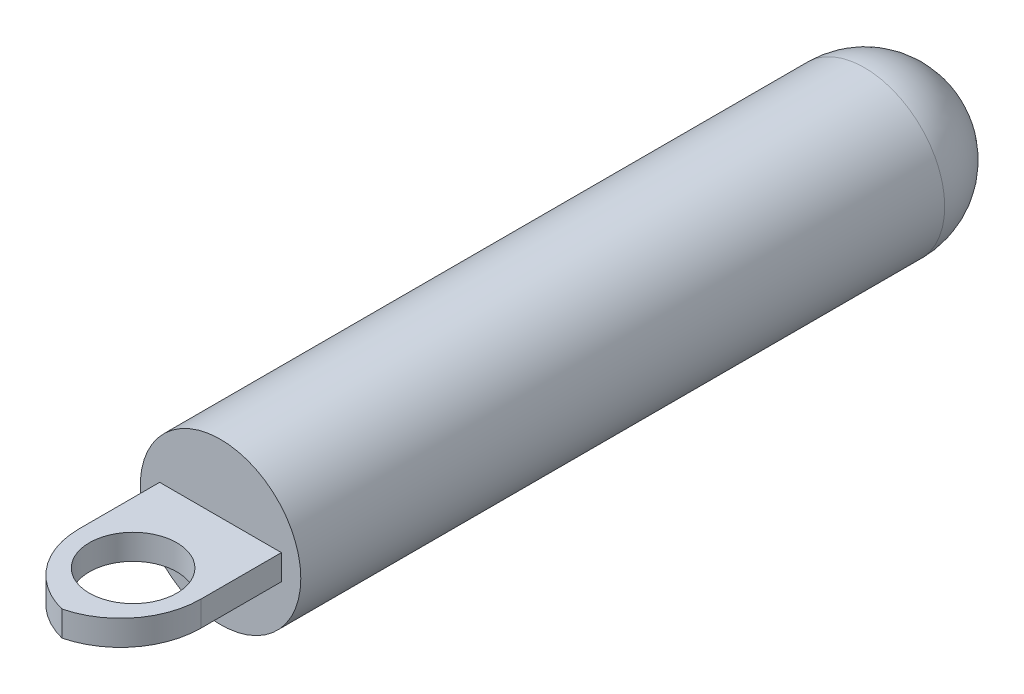
ISO-10303-21;
HEADER;
FILE_DESCRIPTION(('STEP AP214'),'2;1');
FILE_NAME('part.step','',(''),(''),'','','');
FILE_SCHEMA(('AUTOMOTIVE_DESIGN { 1 0 10303 214 1 1 1 1 }'));
ENDSEC;
DATA;
#1=APPLICATION_CONTEXT('core data for automotive mechanical design processes');
#2=APPLICATION_PROTOCOL_DEFINITION('international standard','automotive_design',2000,#1);
#3=PRODUCT_CONTEXT('',#1,'mechanical');
#4=PRODUCT('Part','Part','',(#3));
#5=PRODUCT_RELATED_PRODUCT_CATEGORY('part','',(#4));
#6=PRODUCT_DEFINITION_FORMATION('','',#4);
#7=PRODUCT_DEFINITION_CONTEXT('part definition',#1,'design');
#8=PRODUCT_DEFINITION('design','',#6,#7);
#9=PRODUCT_DEFINITION_SHAPE('','',#8);
#10=(LENGTH_UNIT() NAMED_UNIT(*) SI_UNIT(.MILLI.,.METRE.));
#11=(NAMED_UNIT(*) PLANE_ANGLE_UNIT() SI_UNIT($,.RADIAN.));
#12=(NAMED_UNIT(*) SI_UNIT($,.STERADIAN.) SOLID_ANGLE_UNIT());
#13=UNCERTAINTY_MEASURE_WITH_UNIT(LENGTH_MEASURE(1.E-05),#10,'distance_accuracy_value','');
#14=(GEOMETRIC_REPRESENTATION_CONTEXT(3) GLOBAL_UNCERTAINTY_ASSIGNED_CONTEXT((#13)) GLOBAL_UNIT_ASSIGNED_CONTEXT((#10,
#11,#12)) REPRESENTATION_CONTEXT('',''));
#15=CARTESIAN_POINT('',(0.,0.,0.));
#16=DIRECTION('',(0.,0.,1.));
#17=DIRECTION('',(1.,0.,0.));
#18=AXIS2_PLACEMENT_3D('',#15,#16,#17);
#19=CARTESIAN_POINT('',(0.,0.,16.));
#20=DIRECTION('',(0.,0.,-1.));
#21=DIRECTION('',(-1.,0.,0.));
#22=AXIS2_PLACEMENT_3D('',#19,#20,#21);
#23=CYLINDRICAL_SURFACE('',#22,1.995);
#24=CARTESIAN_POINT('',(0.,0.,16.));
#25=DIRECTION('',(0.,0.,1.));
#26=DIRECTION('',(1.,0.,0.));
#27=AXIS2_PLACEMENT_3D('',#24,#25,#26);
#28=CIRCLE('',#27,1.995);
#29=CARTESIAN_POINT('',(1.995,0.,16.));
#30=VERTEX_POINT('',#29);
#31=EDGE_CURVE('E161',#30,#30,#28,.T.);
#32=ORIENTED_EDGE('',*,*,#31,.F.);
#33=EDGE_LOOP('',(#32));
#34=FACE_BOUND('',#33,.T.);
#35=CARTESIAN_POINT('',(0.,0.,0.));
#36=DIRECTION('',(0.,0.,1.));
#37=DIRECTION('',(1.,0.,0.));
#38=AXIS2_PLACEMENT_3D('',#35,#36,#37);
#39=CIRCLE('',#38,1.995);
#40=CARTESIAN_POINT('',(1.995,0.,0.));
#41=VERTEX_POINT('',#40);
#42=EDGE_CURVE('E159',#41,#41,#39,.T.);
#43=ORIENTED_EDGE('',*,*,#42,.T.);
#44=EDGE_LOOP('',(#43));
#45=FACE_BOUND('',#44,.T.);
#46=ADVANCED_FACE('F83',(#34,#45),#23,.T.);
#47=CARTESIAN_POINT('',(0.,0.,16.));
#48=DIRECTION('',(0.,0.,1.));
#49=DIRECTION('',(1.,0.,0.));
#50=AXIS2_PLACEMENT_3D('',#47,#48,#49);
#51=PLANE('',#50);
#52=DIRECTION('',(0.,1.,0.));
#53=VECTOR('',#52,1.);
#54=CARTESIAN_POINT('',(1.51267010847109,0.313338808183235,16.));
#55=LINE('',#54,#53);
#56=CARTESIAN_POINT('',(1.51267010847109,-0.313338808183235,16.));
#57=VERTEX_POINT('',#56);
#58=CARTESIAN_POINT('',(1.51267010847109,0.313338808183235,16.));
#59=VERTEX_POINT('',#58);
#60=EDGE_CURVE('E149',#57,#59,#55,.T.);
#61=ORIENTED_EDGE('',*,*,#60,.F.);
#62=DIRECTION('',(1.,0.,0.));
#63=VECTOR('',#62,1.);
#64=CARTESIAN_POINT('',(-1.51267010847109,-0.313338808183235,16.));
#65=LINE('',#64,#63);
#66=CARTESIAN_POINT('',(-1.51267010847109,-0.313338808183235,16.));
#67=VERTEX_POINT('',#66);
#68=EDGE_CURVE('E148',#67,#57,#65,.T.);
#69=ORIENTED_EDGE('',*,*,#68,.F.);
#70=DIRECTION('',(0.,-1.,0.));
#71=VECTOR('',#70,1.);
#72=CARTESIAN_POINT('',(-1.51267010847109,0.313338808183235,16.));
#73=LINE('',#72,#71);
#74=CARTESIAN_POINT('',(-1.51267010847109,0.313338808183235,16.));
#75=VERTEX_POINT('',#74);
#76=EDGE_CURVE('E128',#75,#67,#73,.T.);
#77=ORIENTED_EDGE('',*,*,#76,.F.);
#78=DIRECTION('',(-1.,0.,0.));
#79=VECTOR('',#78,1.);
#80=CARTESIAN_POINT('',(-1.51267010847109,0.313338808183235,16.));
#81=LINE('',#80,#79);
#82=EDGE_CURVE('E141',#59,#75,#81,.T.);
#83=ORIENTED_EDGE('',*,*,#82,.F.);
#84=EDGE_LOOP('',(#61,#69,#77,#83));
#85=FACE_BOUND('',#84,.T.);
#86=ORIENTED_EDGE('',*,*,#31,.T.);
#87=EDGE_LOOP('',(#86));
#88=FACE_BOUND('',#87,.T.);
#89=ADVANCED_FACE('F143',(#85,#88),#51,.T.);
#90=CARTESIAN_POINT('',(0.,0.,-0.00499374999999918));
#91=DIRECTION('',(0.,0.,1.));
#92=DIRECTION('',(1.,0.,0.));
#93=AXIS2_PLACEMENT_3D('',#90,#91,#92);
#94=SPHERICAL_SURFACE('',#93,1.99500625);
#95=ORIENTED_EDGE('',*,*,#42,.F.);
#96=EDGE_LOOP('',(#95));
#97=FACE_BOUND('',#96,.T.);
#98=ADVANCED_FACE('F197',(#97),#94,.T.);
#99=CARTESIAN_POINT('',(1.51267010847109,0.313338808183235,20.));
#100=DIRECTION('',(-1.,0.,0.));
#101=DIRECTION('',(0.,0.,1.));
#102=AXIS2_PLACEMENT_3D('',#99,#100,#101);
#103=PLANE('',#102);
#104=DIRECTION('',(0.,0.,-1.));
#105=VECTOR('',#104,1.);
#106=CARTESIAN_POINT('',(1.51267010847109,0.313338808183235,20.));
#107=LINE('',#106,#105);
#108=CARTESIAN_POINT('',(1.51267010847109,0.313338808183235,18.));
#109=VERTEX_POINT('',#108);
#110=EDGE_CURVE('E133',#109,#59,#107,.T.);
#111=ORIENTED_EDGE('',*,*,#110,.F.);
#112=DIRECTION('',(0.,1.,0.));
#113=VECTOR('',#112,1.);
#114=CARTESIAN_POINT('',(1.51267010847109,-0.313338808183235,18.));
#115=LINE('',#114,#113);
#116=CARTESIAN_POINT('',(1.51267010847109,-0.313338808183235,18.));
#117=VERTEX_POINT('',#116);
#118=EDGE_CURVE('E12',#109,#117,#115,.F.);
#119=ORIENTED_EDGE('',*,*,#118,.T.);
#120=DIRECTION('',(0.,0.,-1.));
#121=VECTOR('',#120,1.);
#122=CARTESIAN_POINT('',(1.51267010847109,-0.313338808183235,20.));
#123=LINE('',#122,#121);
#124=EDGE_CURVE('E156',#117,#57,#123,.T.);
#125=ORIENTED_EDGE('',*,*,#124,.T.);
#126=ORIENTED_EDGE('',*,*,#60,.T.);
#127=EDGE_LOOP('',(#111,#119,#125,#126));
#128=FACE_BOUND('',#127,.T.);
#129=ADVANCED_FACE('F186',(#128),#103,.F.);
#130=CARTESIAN_POINT('',(-1.51267010847109,0.313338808183235,20.));
#131=DIRECTION('',(0.,-1.,0.));
#132=DIRECTION('',(0.,0.,-1.));
#133=AXIS2_PLACEMENT_3D('',#130,#131,#132);
#134=PLANE('',#133);
#135=CARTESIAN_POINT('',(0.,0.313338808183235,18.172034212376));
#136=DIRECTION('',(0.,1.,0.));
#137=DIRECTION('',(0.,0.,1.));
#138=AXIS2_PLACEMENT_3D('',#135,#136,#137);
#139=CIRCLE('',#138,1.08651434325027);
#140=CARTESIAN_POINT('',(0.,0.313338808183235,19.2585485556263));
#141=VERTEX_POINT('',#140);
#142=EDGE_CURVE('E180',#141,#141,#139,.T.);
#143=ORIENTED_EDGE('',*,*,#142,.F.);
#144=EDGE_LOOP('',(#143));
#145=FACE_BOUND('',#144,.T.);
#146=DIRECTION('',(0.,0.,-1.));
#147=VECTOR('',#146,1.);
#148=CARTESIAN_POINT('',(-1.51267010847109,0.313338808183235,20.));
#149=LINE('',#148,#147);
#150=CARTESIAN_POINT('',(-1.51267010847109,0.313338808183235,18.));
#151=VERTEX_POINT('',#150);
#152=EDGE_CURVE('E127',#151,#75,#149,.T.);
#153=ORIENTED_EDGE('',*,*,#152,.F.);
#154=CARTESIAN_POINT('',(0.48732989152891,0.313338808183235,18.));
#155=DIRECTION('',(0.,-1.,0.));
#156=DIRECTION('',(0.,0.,-1.));
#157=AXIS2_PLACEMENT_3D('',#154,#155,#156);
#158=CIRCLE('',#157,2.);
#159=CARTESIAN_POINT('',(0.,0.313338808183235,19.9397189427395));
#160=VERTEX_POINT('',#159);
#161=EDGE_CURVE('E89',#151,#160,#158,.F.);
#162=ORIENTED_EDGE('',*,*,#161,.T.);
#163=CARTESIAN_POINT('',(-0.48732989152891,0.313338808183235,18.));
#164=DIRECTION('',(0.,-1.,0.));
#165=DIRECTION('',(0.,0.,-1.));
#166=AXIS2_PLACEMENT_3D('',#163,#164,#165);
#167=CIRCLE('',#166,2.);
#168=EDGE_CURVE('E101',#160,#109,#167,.F.);
#169=ORIENTED_EDGE('',*,*,#168,.T.);
#170=ORIENTED_EDGE('',*,*,#110,.T.);
#171=ORIENTED_EDGE('',*,*,#82,.T.);
#172=EDGE_LOOP('',(#153,#162,#169,#170,#171));
#173=FACE_BOUND('',#172,.T.);
#174=ADVANCED_FACE('F146',(#145,#173),#134,.F.);
#175=CARTESIAN_POINT('',(-1.51267010847109,0.313338808183235,20.));
#176=DIRECTION('',(1.,0.,0.));
#177=DIRECTION('',(0.,0.,-1.));
#178=AXIS2_PLACEMENT_3D('',#175,#176,#177);
#179=PLANE('',#178);
#180=DIRECTION('',(0.,0.,-1.));
#181=VECTOR('',#180,1.);
#182=CARTESIAN_POINT('',(-1.51267010847109,-0.313338808183235,20.));
#183=LINE('',#182,#181);
#184=CARTESIAN_POINT('',(-1.51267010847109,-0.313338808183235,18.));
#185=VERTEX_POINT('',#184);
#186=EDGE_CURVE('E132',#185,#67,#183,.T.);
#187=ORIENTED_EDGE('',*,*,#186,.F.);
#188=DIRECTION('',(0.,-1.,0.));
#189=VECTOR('',#188,1.);
#190=CARTESIAN_POINT('',(-1.51267010847109,0.313338808183235,18.));
#191=LINE('',#190,#189);
#192=EDGE_CURVE('E131',#185,#151,#191,.F.);
#193=ORIENTED_EDGE('',*,*,#192,.T.);
#194=ORIENTED_EDGE('',*,*,#152,.T.);
#195=ORIENTED_EDGE('',*,*,#76,.T.);
#196=EDGE_LOOP('',(#187,#193,#194,#195));
#197=FACE_BOUND('',#196,.T.);
#198=ADVANCED_FACE('F129',(#197),#179,.F.);
#199=CARTESIAN_POINT('',(-1.51267010847109,-0.313338808183235,20.));
#200=DIRECTION('',(0.,1.,0.));
#201=DIRECTION('',(0.,0.,1.));
#202=AXIS2_PLACEMENT_3D('',#199,#200,#201);
#203=PLANE('',#202);
#204=CARTESIAN_POINT('',(0.,-0.313338808183235,18.172034212376));
#205=DIRECTION('',(0.,1.,0.));
#206=DIRECTION('',(0.,0.,1.));
#207=AXIS2_PLACEMENT_3D('',#204,#205,#206);
#208=CIRCLE('',#207,1.08651434325027);
#209=CARTESIAN_POINT('',(0.,-0.313338808183235,19.2585485556263));
#210=VERTEX_POINT('',#209);
#211=EDGE_CURVE('E82',#210,#210,#208,.T.);
#212=ORIENTED_EDGE('',*,*,#211,.T.);
#213=EDGE_LOOP('',(#212));
#214=FACE_BOUND('',#213,.T.);
#215=CARTESIAN_POINT('',(-0.48732989152891,-0.313338808183235,18.));
#216=DIRECTION('',(0.,1.,0.));
#217=DIRECTION('',(0.,0.,1.));
#218=AXIS2_PLACEMENT_3D('',#215,#216,#217);
#219=CIRCLE('',#218,2.);
#220=CARTESIAN_POINT('',(0.,-0.313338808183235,19.9397189427395));
#221=VERTEX_POINT('',#220);
#222=EDGE_CURVE('E163',#117,#221,#219,.F.);
#223=ORIENTED_EDGE('',*,*,#222,.T.);
#224=CARTESIAN_POINT('',(0.48732989152891,-0.313338808183235,18.));
#225=DIRECTION('',(0.,1.,0.));
#226=DIRECTION('',(0.,0.,1.));
#227=AXIS2_PLACEMENT_3D('',#224,#225,#226);
#228=CIRCLE('',#227,2.);
#229=EDGE_CURVE('E169',#221,#185,#228,.F.);
#230=ORIENTED_EDGE('',*,*,#229,.T.);
#231=ORIENTED_EDGE('',*,*,#186,.T.);
#232=ORIENTED_EDGE('',*,*,#68,.T.);
#233=ORIENTED_EDGE('',*,*,#124,.F.);
#234=EDGE_LOOP('',(#223,#230,#231,#232,#233));
#235=FACE_BOUND('',#234,.T.);
#236=ADVANCED_FACE('F194',(#214,#235),#203,.F.);
#237=CARTESIAN_POINT('',(-0.48732989152891,0.,18.));
#238=DIRECTION('',(0.,-1.,0.));
#239=DIRECTION('',(0.,0.,-1.));
#240=AXIS2_PLACEMENT_3D('',#237,#238,#239);
#241=CYLINDRICAL_SURFACE('',#240,2.);
#242=ORIENTED_EDGE('',*,*,#118,.F.);
#243=ORIENTED_EDGE('',*,*,#168,.F.);
#244=DIRECTION('',(0.,-1.,0.));
#245=VECTOR('',#244,1.);
#246=CARTESIAN_POINT('',(0.,0.,19.9397189427395));
#247=LINE('',#246,#245);
#248=EDGE_CURVE('E151',#221,#160,#247,.F.);
#249=ORIENTED_EDGE('',*,*,#248,.F.);
#250=ORIENTED_EDGE('',*,*,#222,.F.);
#251=EDGE_LOOP('',(#242,#243,#249,#250));
#252=FACE_BOUND('',#251,.T.);
#253=ADVANCED_FACE('F81',(#252),#241,.T.);
#254=CARTESIAN_POINT('',(0.48732989152891,0.,18.));
#255=DIRECTION('',(0.,1.,0.));
#256=DIRECTION('',(0.,0.,1.));
#257=AXIS2_PLACEMENT_3D('',#254,#255,#256);
#258=CYLINDRICAL_SURFACE('',#257,2.);
#259=ORIENTED_EDGE('',*,*,#161,.F.);
#260=ORIENTED_EDGE('',*,*,#192,.F.);
#261=ORIENTED_EDGE('',*,*,#229,.F.);
#262=ORIENTED_EDGE('',*,*,#248,.T.);
#263=EDGE_LOOP('',(#259,#260,#261,#262));
#264=FACE_BOUND('',#263,.T.);
#265=ADVANCED_FACE('F215',(#264),#258,.T.);
#266=CARTESIAN_POINT('',(0.,-3.68666119181677,18.172034212376));
#267=DIRECTION('',(0.,1.,0.));
#268=DIRECTION('',(0.,0.,1.));
#269=AXIS2_PLACEMENT_3D('',#266,#267,#268);
#270=CYLINDRICAL_SURFACE('',#269,1.08651434325027);
#271=ORIENTED_EDGE('',*,*,#142,.T.);
#272=EDGE_LOOP('',(#271));
#273=FACE_BOUND('',#272,.T.);
#274=ORIENTED_EDGE('',*,*,#211,.F.);
#275=EDGE_LOOP('',(#274));
#276=FACE_BOUND('',#275,.T.);
#277=ADVANCED_FACE('F181',(#273,#276),#270,.F.);
#278=CLOSED_SHELL('',(#46,#89,#98,#129,#174,#198,#236,#253,#265,#277));
#279=MANIFOLD_SOLID_BREP('B2',#278);
#280=ADVANCED_BREP_SHAPE_REPRESENTATION('',(#18,#279),#14);
#281=SHAPE_DEFINITION_REPRESENTATION(#9,#280);
ENDSEC;
END-ISO-10303-21;
